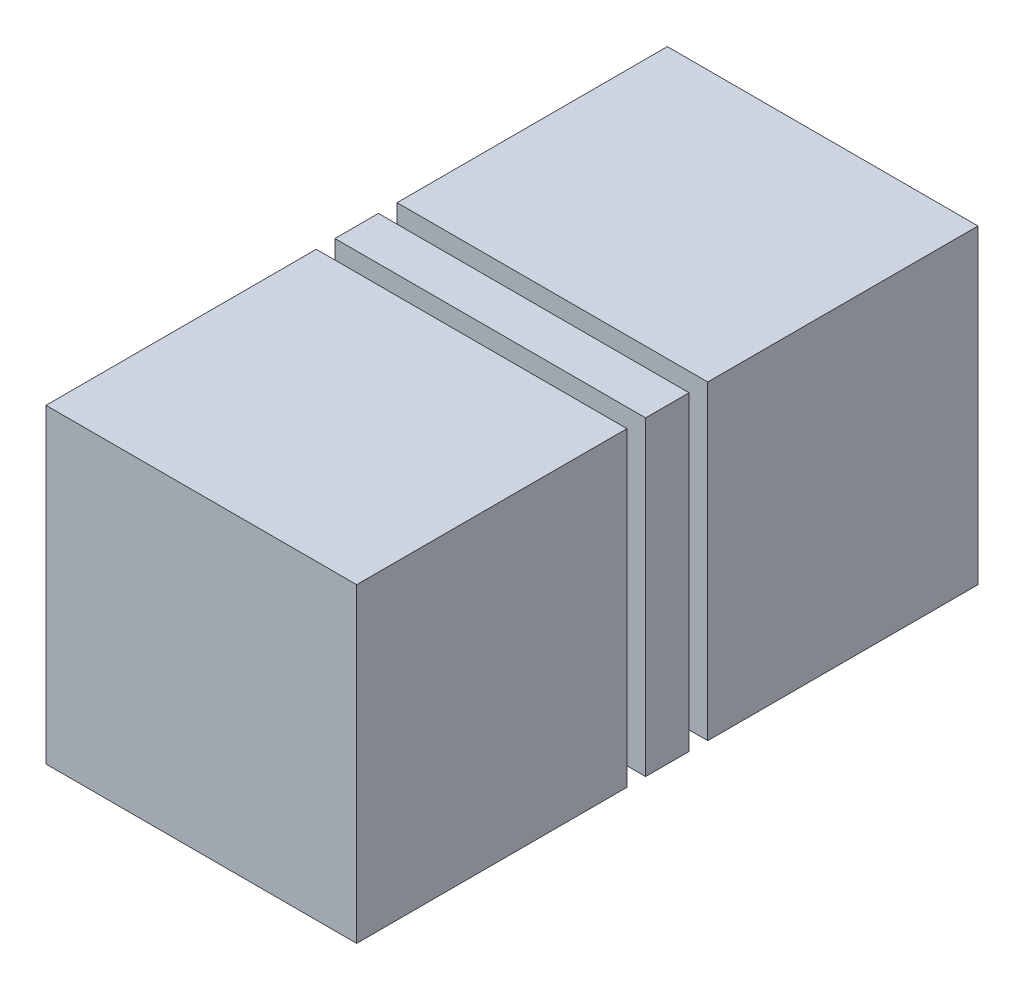
ISO-10303-21;
HEADER;
FILE_DESCRIPTION(('STEP AP214'),'2;1');
FILE_NAME('part.step','',(''),(''),'','','');
FILE_SCHEMA(('AUTOMOTIVE_DESIGN { 1 0 10303 214 1 1 1 1 }'));
ENDSEC;
DATA;
#1=APPLICATION_CONTEXT('core data for automotive mechanical design processes');
#2=APPLICATION_PROTOCOL_DEFINITION('international standard','automotive_design',2000,#1);
#3=PRODUCT_CONTEXT('',#1,'mechanical');
#4=PRODUCT('Part','Part','',(#3));
#5=PRODUCT_RELATED_PRODUCT_CATEGORY('part','',(#4));
#6=PRODUCT_DEFINITION_FORMATION('','',#4);
#7=PRODUCT_DEFINITION_CONTEXT('part definition',#1,'design');
#8=PRODUCT_DEFINITION('design','',#6,#7);
#9=PRODUCT_DEFINITION_SHAPE('','',#8);
#10=(LENGTH_UNIT() NAMED_UNIT(*) SI_UNIT(.MILLI.,.METRE.));
#11=(NAMED_UNIT(*) PLANE_ANGLE_UNIT() SI_UNIT($,.RADIAN.));
#12=(NAMED_UNIT(*) SI_UNIT($,.STERADIAN.) SOLID_ANGLE_UNIT());
#13=UNCERTAINTY_MEASURE_WITH_UNIT(LENGTH_MEASURE(1.E-05),#10,'distance_accuracy_value','');
#14=(GEOMETRIC_REPRESENTATION_CONTEXT(3) GLOBAL_UNCERTAINTY_ASSIGNED_CONTEXT((#13)) GLOBAL_UNIT_ASSIGNED_CONTEXT((#10,
#11,#12)) REPRESENTATION_CONTEXT('',''));
#15=CARTESIAN_POINT('',(0.,0.,0.));
#16=DIRECTION('',(0.,0.,1.));
#17=DIRECTION('',(1.,0.,0.));
#18=AXIS2_PLACEMENT_3D('',#15,#16,#17);
#19=CARTESIAN_POINT('',(25.,-25.,-50.));
#20=DIRECTION('',(0.,1.,0.));
#21=DIRECTION('',(0.,0.,1.));
#22=AXIS2_PLACEMENT_3D('',#19,#20,#21);
#23=PLANE('',#22);
#24=DIRECTION('',(0.,0.,-1.));
#25=VECTOR('',#24,1.);
#26=CARTESIAN_POINT('',(-25.,-25.,-50.));
#27=LINE('',#26,#25);
#28=CARTESIAN_POINT('',(-25.,-25.,3.5));
#29=VERTEX_POINT('',#28);
#30=CARTESIAN_POINT('',(-25.,-25.,-3.5));
#31=VERTEX_POINT('',#30);
#32=EDGE_CURVE('E306',#29,#31,#27,.T.);
#33=ORIENTED_EDGE('',*,*,#32,.T.);
#34=DIRECTION('',(1.,0.,0.));
#35=VECTOR('',#34,1.);
#36=CARTESIAN_POINT('',(25.,-25.,-3.5));
#37=LINE('',#36,#35);
#38=CARTESIAN_POINT('',(25.,-25.,-3.5));
#39=VERTEX_POINT('',#38);
#40=EDGE_CURVE('E55',#31,#39,#37,.T.);
#41=ORIENTED_EDGE('',*,*,#40,.T.);
#42=DIRECTION('',(0.,0.,-1.));
#43=VECTOR('',#42,1.);
#44=CARTESIAN_POINT('',(25.,-25.,-50.));
#45=LINE('',#44,#43);
#46=CARTESIAN_POINT('',(25.,-25.,3.5));
#47=VERTEX_POINT('',#46);
#48=EDGE_CURVE('E291',#47,#39,#45,.T.);
#49=ORIENTED_EDGE('',*,*,#48,.F.);
#50=DIRECTION('',(1.,0.,0.));
#51=VECTOR('',#50,1.);
#52=CARTESIAN_POINT('',(25.,-25.,3.5));
#53=LINE('',#52,#51);
#54=EDGE_CURVE('E269',#29,#47,#53,.T.);
#55=ORIENTED_EDGE('',*,*,#54,.F.);
#56=EDGE_LOOP('',(#33,#41,#49,#55));
#57=FACE_BOUND('',#56,.T.);
#58=ADVANCED_FACE('F32',(#57),#23,.F.);
#59=CARTESIAN_POINT('',(25.,25.,-50.));
#60=DIRECTION('',(0.,-1.,0.));
#61=DIRECTION('',(0.,0.,-1.));
#62=AXIS2_PLACEMENT_3D('',#59,#60,#61);
#63=PLANE('',#62);
#64=DIRECTION('',(0.,0.,1.));
#65=VECTOR('',#64,1.);
#66=CARTESIAN_POINT('',(25.,25.,-50.));
#67=LINE('',#66,#65);
#68=CARTESIAN_POINT('',(25.,25.,-3.5));
#69=VERTEX_POINT('',#68);
#70=CARTESIAN_POINT('',(25.,25.,3.5));
#71=VERTEX_POINT('',#70);
#72=EDGE_CURVE('E298',#69,#71,#67,.T.);
#73=ORIENTED_EDGE('',*,*,#72,.F.);
#74=DIRECTION('',(-1.,0.,0.));
#75=VECTOR('',#74,1.);
#76=CARTESIAN_POINT('',(25.,25.,-3.5));
#77=LINE('',#76,#75);
#78=CARTESIAN_POINT('',(-25.,25.,-3.5));
#79=VERTEX_POINT('',#78);
#80=EDGE_CURVE('E218',#69,#79,#77,.T.);
#81=ORIENTED_EDGE('',*,*,#80,.T.);
#82=DIRECTION('',(0.,0.,1.));
#83=VECTOR('',#82,1.);
#84=CARTESIAN_POINT('',(-25.,25.,-50.));
#85=LINE('',#84,#83);
#86=CARTESIAN_POINT('',(-25.,25.,3.5));
#87=VERTEX_POINT('',#86);
#88=EDGE_CURVE('E311',#79,#87,#85,.T.);
#89=ORIENTED_EDGE('',*,*,#88,.T.);
#90=DIRECTION('',(-1.,0.,0.));
#91=VECTOR('',#90,1.);
#92=CARTESIAN_POINT('',(25.,25.,3.5));
#93=LINE('',#92,#91);
#94=EDGE_CURVE('E263',#71,#87,#93,.T.);
#95=ORIENTED_EDGE('',*,*,#94,.F.);
#96=EDGE_LOOP('',(#73,#81,#89,#95));
#97=FACE_BOUND('',#96,.T.);
#98=ADVANCED_FACE('F368',(#97),#63,.F.);
#99=CARTESIAN_POINT('',(25.,0.,0.));
#100=DIRECTION('',(1.,0.,0.));
#101=DIRECTION('',(0.,0.,-1.));
#102=AXIS2_PLACEMENT_3D('',#99,#100,#101);
#103=PLANE('',#102);
#104=DIRECTION('',(0.,1.,0.));
#105=VECTOR('',#104,1.);
#106=CARTESIAN_POINT('',(25.,25.,-3.5));
#107=LINE('',#106,#105);
#108=EDGE_CURVE('E212',#39,#69,#107,.T.);
#109=ORIENTED_EDGE('',*,*,#108,.T.);
#110=ORIENTED_EDGE('',*,*,#72,.T.);
#111=DIRECTION('',(0.,1.,0.));
#112=VECTOR('',#111,1.);
#113=CARTESIAN_POINT('',(25.,25.,3.5));
#114=LINE('',#113,#112);
#115=EDGE_CURVE('E260',#47,#71,#114,.T.);
#116=ORIENTED_EDGE('',*,*,#115,.F.);
#117=ORIENTED_EDGE('',*,*,#48,.T.);
#118=EDGE_LOOP('',(#109,#110,#116,#117));
#119=FACE_BOUND('',#118,.T.);
#120=ADVANCED_FACE('F340',(#119),#103,.T.);
#121=CARTESIAN_POINT('',(-25.,0.,0.));
#122=DIRECTION('',(1.,0.,0.));
#123=DIRECTION('',(0.,0.,-1.));
#124=AXIS2_PLACEMENT_3D('',#121,#122,#123);
#125=PLANE('',#124);
#126=ORIENTED_EDGE('',*,*,#88,.F.);
#127=DIRECTION('',(0.,-1.,0.));
#128=VECTOR('',#127,1.);
#129=CARTESIAN_POINT('',(-25.,25.,-3.5));
#130=LINE('',#129,#128);
#131=EDGE_CURVE('E216',#79,#31,#130,.T.);
#132=ORIENTED_EDGE('',*,*,#131,.T.);
#133=ORIENTED_EDGE('',*,*,#32,.F.);
#134=DIRECTION('',(0.,-1.,0.));
#135=VECTOR('',#134,1.);
#136=CARTESIAN_POINT('',(-25.,25.,3.5));
#137=LINE('',#136,#135);
#138=EDGE_CURVE('E267',#87,#29,#137,.T.);
#139=ORIENTED_EDGE('',*,*,#138,.F.);
#140=EDGE_LOOP('',(#126,#132,#133,#139));
#141=FACE_BOUND('',#140,.T.);
#142=ADVANCED_FACE('F403',(#141),#125,.F.);
#143=CARTESIAN_POINT('',(0.,0.,3.5));
#144=DIRECTION('',(0.,0.,-1.));
#145=DIRECTION('',(-1.,0.,0.));
#146=AXIS2_PLACEMENT_3D('',#143,#144,#145);
#147=PLANE('',#146);
#148=DIRECTION('',(-1.,0.,0.));
#149=VECTOR('',#148,1.);
#150=CARTESIAN_POINT('',(22.,22.,3.5));
#151=LINE('',#150,#149);
#152=CARTESIAN_POINT('',(22.,22.,3.5));
#153=VERTEX_POINT('',#152);
#154=CARTESIAN_POINT('',(-22.,22.,3.5));
#155=VERTEX_POINT('',#154);
#156=EDGE_CURVE('E228',#153,#155,#151,.T.);
#157=ORIENTED_EDGE('',*,*,#156,.F.);
#158=DIRECTION('',(0.,1.,0.));
#159=VECTOR('',#158,1.);
#160=CARTESIAN_POINT('',(22.,-22.,3.5));
#161=LINE('',#160,#159);
#162=CARTESIAN_POINT('',(22.,-22.,3.5));
#163=VERTEX_POINT('',#162);
#164=EDGE_CURVE('E238',#163,#153,#161,.T.);
#165=ORIENTED_EDGE('',*,*,#164,.F.);
#166=DIRECTION('',(1.,0.,0.));
#167=VECTOR('',#166,1.);
#168=CARTESIAN_POINT('',(-22.,-22.,3.5));
#169=LINE('',#168,#167);
#170=CARTESIAN_POINT('',(-22.,-22.,3.5));
#171=VERTEX_POINT('',#170);
#172=EDGE_CURVE('E235',#171,#163,#169,.T.);
#173=ORIENTED_EDGE('',*,*,#172,.F.);
#174=DIRECTION('',(0.,-1.,0.));
#175=VECTOR('',#174,1.);
#176=CARTESIAN_POINT('',(-22.,22.,3.5));
#177=LINE('',#176,#175);
#178=EDGE_CURVE('E231',#155,#171,#177,.T.);
#179=ORIENTED_EDGE('',*,*,#178,.F.);
#180=EDGE_LOOP('',(#157,#165,#173,#179));
#181=FACE_BOUND('',#180,.T.);
#182=ORIENTED_EDGE('',*,*,#115,.T.);
#183=ORIENTED_EDGE('',*,*,#94,.T.);
#184=ORIENTED_EDGE('',*,*,#138,.T.);
#185=ORIENTED_EDGE('',*,*,#54,.T.);
#186=EDGE_LOOP('',(#182,#183,#184,#185));
#187=FACE_BOUND('',#186,.T.);
#188=ADVANCED_FACE('F401',(#181,#187),#147,.F.);
#189=CARTESIAN_POINT('',(0.,0.,6.5));
#190=DIRECTION('',(0.,0.,-1.));
#191=DIRECTION('',(-1.,0.,0.));
#192=AXIS2_PLACEMENT_3D('',#189,#190,#191);
#193=PLANE('',#192);
#194=DIRECTION('',(0.,-1.,0.));
#195=VECTOR('',#194,1.);
#196=CARTESIAN_POINT('',(-22.,22.,6.5));
#197=LINE('',#196,#195);
#198=CARTESIAN_POINT('',(-22.,22.,6.5));
#199=VERTEX_POINT('',#198);
#200=CARTESIAN_POINT('',(-22.,-22.,6.5));
#201=VERTEX_POINT('',#200);
#202=EDGE_CURVE('E243',#199,#201,#197,.T.);
#203=ORIENTED_EDGE('',*,*,#202,.T.);
#204=DIRECTION('',(1.,0.,0.));
#205=VECTOR('',#204,1.);
#206=CARTESIAN_POINT('',(-22.,-22.,6.5));
#207=LINE('',#206,#205);
#208=CARTESIAN_POINT('',(22.,-22.,6.5));
#209=VERTEX_POINT('',#208);
#210=EDGE_CURVE('E246',#201,#209,#207,.T.);
#211=ORIENTED_EDGE('',*,*,#210,.T.);
#212=DIRECTION('',(0.,1.,0.));
#213=VECTOR('',#212,1.);
#214=CARTESIAN_POINT('',(22.,-22.,6.5));
#215=LINE('',#214,#213);
#216=CARTESIAN_POINT('',(22.,22.,6.5));
#217=VERTEX_POINT('',#216);
#218=EDGE_CURVE('E232',#209,#217,#215,.T.);
#219=ORIENTED_EDGE('',*,*,#218,.T.);
#220=DIRECTION('',(-1.,0.,0.));
#221=VECTOR('',#220,1.);
#222=CARTESIAN_POINT('',(22.,22.,6.5));
#223=LINE('',#222,#221);
#224=EDGE_CURVE('E221',#217,#199,#223,.T.);
#225=ORIENTED_EDGE('',*,*,#224,.T.);
#226=EDGE_LOOP('',(#203,#211,#219,#225));
#227=FACE_BOUND('',#226,.T.);
#228=DIRECTION('',(0.,1.,0.));
#229=VECTOR('',#228,1.);
#230=CARTESIAN_POINT('',(25.,25.,6.5));
#231=LINE('',#230,#229);
#232=CARTESIAN_POINT('',(25.,-25.,6.5));
#233=VERTEX_POINT('',#232);
#234=CARTESIAN_POINT('',(25.,25.,6.5));
#235=VERTEX_POINT('',#234);
#236=EDGE_CURVE('E253',#233,#235,#231,.T.);
#237=ORIENTED_EDGE('',*,*,#236,.F.);
#238=DIRECTION('',(1.,0.,0.));
#239=VECTOR('',#238,1.);
#240=CARTESIAN_POINT('',(25.,-25.,6.5));
#241=LINE('',#240,#239);
#242=CARTESIAN_POINT('',(-25.,-25.,6.5));
#243=VERTEX_POINT('',#242);
#244=EDGE_CURVE('E264',#243,#233,#241,.T.);
#245=ORIENTED_EDGE('',*,*,#244,.F.);
#246=DIRECTION('',(0.,-1.,0.));
#247=VECTOR('',#246,1.);
#248=CARTESIAN_POINT('',(-25.,25.,6.5));
#249=LINE('',#248,#247);
#250=CARTESIAN_POINT('',(-25.,25.,6.5));
#251=VERTEX_POINT('',#250);
#252=EDGE_CURVE('E277',#251,#243,#249,.T.);
#253=ORIENTED_EDGE('',*,*,#252,.F.);
#254=DIRECTION('',(-1.,0.,0.));
#255=VECTOR('',#254,1.);
#256=CARTESIAN_POINT('',(25.,25.,6.5));
#257=LINE('',#256,#255);
#258=EDGE_CURVE('E274',#235,#251,#257,.T.);
#259=ORIENTED_EDGE('',*,*,#258,.F.);
#260=EDGE_LOOP('',(#237,#245,#253,#259));
#261=FACE_BOUND('',#260,.T.);
#262=ADVANCED_FACE('F398',(#227,#261),#193,.T.);
#263=CARTESIAN_POINT('',(22.,22.,3.5));
#264=DIRECTION('',(0.,1.,0.));
#265=DIRECTION('',(0.,0.,1.));
#266=AXIS2_PLACEMENT_3D('',#263,#264,#265);
#267=PLANE('',#266);
#268=ORIENTED_EDGE('',*,*,#224,.F.);
#269=DIRECTION('',(0.,0.,1.));
#270=VECTOR('',#269,1.);
#271=CARTESIAN_POINT('',(22.,22.,3.5));
#272=LINE('',#271,#270);
#273=EDGE_CURVE('E251',#153,#217,#272,.T.);
#274=ORIENTED_EDGE('',*,*,#273,.F.);
#275=ORIENTED_EDGE('',*,*,#156,.T.);
#276=DIRECTION('',(0.,0.,1.));
#277=VECTOR('',#276,1.);
#278=CARTESIAN_POINT('',(-22.,22.,3.5));
#279=LINE('',#278,#277);
#280=EDGE_CURVE('E241',#155,#199,#279,.T.);
#281=ORIENTED_EDGE('',*,*,#280,.T.);
#282=EDGE_LOOP('',(#268,#274,#275,#281));
#283=FACE_BOUND('',#282,.T.);
#284=ADVANCED_FACE('F498',(#283),#267,.T.);
#285=CARTESIAN_POINT('',(22.,-22.,3.5));
#286=DIRECTION('',(1.,0.,0.));
#287=DIRECTION('',(0.,0.,-1.));
#288=AXIS2_PLACEMENT_3D('',#285,#286,#287);
#289=PLANE('',#288);
#290=ORIENTED_EDGE('',*,*,#218,.F.);
#291=DIRECTION('',(0.,0.,1.));
#292=VECTOR('',#291,1.);
#293=CARTESIAN_POINT('',(22.,-22.,3.5));
#294=LINE('',#293,#292);
#295=EDGE_CURVE('E254',#163,#209,#294,.T.);
#296=ORIENTED_EDGE('',*,*,#295,.F.);
#297=ORIENTED_EDGE('',*,*,#164,.T.);
#298=ORIENTED_EDGE('',*,*,#273,.T.);
#299=EDGE_LOOP('',(#290,#296,#297,#298));
#300=FACE_BOUND('',#299,.T.);
#301=ADVANCED_FACE('F494',(#300),#289,.T.);
#302=CARTESIAN_POINT('',(-22.,-22.,3.5));
#303=DIRECTION('',(0.,-1.,0.));
#304=DIRECTION('',(0.,0.,-1.));
#305=AXIS2_PLACEMENT_3D('',#302,#303,#304);
#306=PLANE('',#305);
#307=ORIENTED_EDGE('',*,*,#210,.F.);
#308=DIRECTION('',(0.,0.,1.));
#309=VECTOR('',#308,1.);
#310=CARTESIAN_POINT('',(-22.,-22.,3.5));
#311=LINE('',#310,#309);
#312=EDGE_CURVE('E256',#171,#201,#311,.T.);
#313=ORIENTED_EDGE('',*,*,#312,.F.);
#314=ORIENTED_EDGE('',*,*,#172,.T.);
#315=ORIENTED_EDGE('',*,*,#295,.T.);
#316=EDGE_LOOP('',(#307,#313,#314,#315));
#317=FACE_BOUND('',#316,.T.);
#318=ADVANCED_FACE('F497',(#317),#306,.T.);
#319=CARTESIAN_POINT('',(-22.,22.,3.5));
#320=DIRECTION('',(-1.,0.,0.));
#321=DIRECTION('',(0.,0.,1.));
#322=AXIS2_PLACEMENT_3D('',#319,#320,#321);
#323=PLANE('',#322);
#324=ORIENTED_EDGE('',*,*,#202,.F.);
#325=ORIENTED_EDGE('',*,*,#280,.F.);
#326=ORIENTED_EDGE('',*,*,#178,.T.);
#327=ORIENTED_EDGE('',*,*,#312,.T.);
#328=EDGE_LOOP('',(#324,#325,#326,#327));
#329=FACE_BOUND('',#328,.T.);
#330=ADVANCED_FACE('F421',(#329),#323,.T.);
#331=CARTESIAN_POINT('',(25.,-25.,50.));
#332=DIRECTION('',(0.,0.,-1.));
#333=DIRECTION('',(-1.,0.,0.));
#334=AXIS2_PLACEMENT_3D('',#331,#332,#333);
#335=PLANE('',#334);
#336=DIRECTION('',(0.,-1.,0.));
#337=VECTOR('',#336,1.);
#338=CARTESIAN_POINT('',(-25.,-25.,50.));
#339=LINE('',#338,#337);
#340=CARTESIAN_POINT('',(-25.,25.,50.));
#341=VERTEX_POINT('',#340);
#342=CARTESIAN_POINT('',(-25.,-25.,50.));
#343=VERTEX_POINT('',#342);
#344=EDGE_CURVE('E271',#341,#343,#339,.T.);
#345=ORIENTED_EDGE('',*,*,#344,.T.);
#346=DIRECTION('',(-1.,0.,0.));
#347=VECTOR('',#346,1.);
#348=CARTESIAN_POINT('',(25.,-25.,50.));
#349=LINE('',#348,#347);
#350=CARTESIAN_POINT('',(25.,-25.,50.));
#351=VERTEX_POINT('',#350);
#352=EDGE_CURVE('E11',#351,#343,#349,.T.);
#353=ORIENTED_EDGE('',*,*,#352,.F.);
#354=DIRECTION('',(0.,-1.,0.));
#355=VECTOR('',#354,1.);
#356=CARTESIAN_POINT('',(25.,-25.,50.));
#357=LINE('',#356,#355);
#358=CARTESIAN_POINT('',(25.,25.,50.));
#359=VERTEX_POINT('',#358);
#360=EDGE_CURVE('E282',#359,#351,#357,.T.);
#361=ORIENTED_EDGE('',*,*,#360,.F.);
#362=DIRECTION('',(-1.,0.,0.));
#363=VECTOR('',#362,1.);
#364=CARTESIAN_POINT('',(25.,25.,50.));
#365=LINE('',#364,#363);
#366=EDGE_CURVE('E297',#359,#341,#365,.T.);
#367=ORIENTED_EDGE('',*,*,#366,.T.);
#368=EDGE_LOOP('',(#345,#353,#361,#367));
#369=FACE_BOUND('',#368,.T.);
#370=ADVANCED_FACE('F34',(#369),#335,.F.);
#371=EDGE_CURVE('E287',#351,#233,#45,.T.);
#372=ORIENTED_EDGE('',*,*,#371,.T.);
#373=ORIENTED_EDGE('',*,*,#236,.T.);
#374=EDGE_CURVE('E293',#235,#359,#67,.T.);
#375=ORIENTED_EDGE('',*,*,#374,.T.);
#376=ORIENTED_EDGE('',*,*,#360,.T.);
#377=EDGE_LOOP('',(#372,#373,#375,#376));
#378=FACE_BOUND('',#377,.T.);
#379=ADVANCED_FACE('F389',(#378),#103,.T.);
#380=ORIENTED_EDGE('',*,*,#252,.T.);
#381=EDGE_CURVE('E302',#343,#243,#27,.T.);
#382=ORIENTED_EDGE('',*,*,#381,.F.);
#383=ORIENTED_EDGE('',*,*,#344,.F.);
#384=EDGE_CURVE('E308',#251,#341,#85,.T.);
#385=ORIENTED_EDGE('',*,*,#384,.F.);
#386=EDGE_LOOP('',(#380,#382,#383,#385));
#387=FACE_BOUND('',#386,.T.);
#388=ADVANCED_FACE('F385',(#387),#125,.F.);
#389=ORIENTED_EDGE('',*,*,#258,.T.);
#390=ORIENTED_EDGE('',*,*,#384,.T.);
#391=ORIENTED_EDGE('',*,*,#366,.F.);
#392=ORIENTED_EDGE('',*,*,#374,.F.);
#393=EDGE_LOOP('',(#389,#390,#391,#392));
#394=FACE_BOUND('',#393,.T.);
#395=ADVANCED_FACE('F375',(#394),#63,.F.);
#396=ORIENTED_EDGE('',*,*,#244,.T.);
#397=ORIENTED_EDGE('',*,*,#371,.F.);
#398=ORIENTED_EDGE('',*,*,#352,.T.);
#399=ORIENTED_EDGE('',*,*,#381,.T.);
#400=EDGE_LOOP('',(#396,#397,#398,#399));
#401=FACE_BOUND('',#400,.T.);
#402=ADVANCED_FACE('F369',(#401),#23,.F.);
#403=CARTESIAN_POINT('',(0.,0.,-3.5));
#404=DIRECTION('',(0.,0.,1.));
#405=DIRECTION('',(-1.,0.,0.));
#406=AXIS2_PLACEMENT_3D('',#403,#404,#405);
#407=PLANE('',#406);
#408=ORIENTED_EDGE('',*,*,#108,.F.);
#409=ORIENTED_EDGE('',*,*,#40,.F.);
#410=ORIENTED_EDGE('',*,*,#131,.F.);
#411=ORIENTED_EDGE('',*,*,#80,.F.);
#412=EDGE_LOOP('',(#408,#409,#410,#411));
#413=FACE_BOUND('',#412,.T.);
#414=DIRECTION('',(0.,-1.,0.));
#415=VECTOR('',#414,1.);
#416=CARTESIAN_POINT('',(-22.,22.,-3.5));
#417=LINE('',#416,#415);
#418=CARTESIAN_POINT('',(-22.,22.,-3.5));
#419=VERTEX_POINT('',#418);
#420=CARTESIAN_POINT('',(-22.,-22.,-3.5));
#421=VERTEX_POINT('',#420);
#422=EDGE_CURVE('E188',#419,#421,#417,.T.);
#423=ORIENTED_EDGE('',*,*,#422,.T.);
#424=DIRECTION('',(1.,0.,0.));
#425=VECTOR('',#424,1.);
#426=CARTESIAN_POINT('',(-22.,-22.,-3.5));
#427=LINE('',#426,#425);
#428=CARTESIAN_POINT('',(22.,-22.,-3.5));
#429=VERTEX_POINT('',#428);
#430=EDGE_CURVE('E176',#421,#429,#427,.T.);
#431=ORIENTED_EDGE('',*,*,#430,.T.);
#432=DIRECTION('',(0.,1.,0.));
#433=VECTOR('',#432,1.);
#434=CARTESIAN_POINT('',(22.,-22.,-3.5));
#435=LINE('',#434,#433);
#436=CARTESIAN_POINT('',(22.,22.,-3.5));
#437=VERTEX_POINT('',#436);
#438=EDGE_CURVE('E169',#429,#437,#435,.T.);
#439=ORIENTED_EDGE('',*,*,#438,.T.);
#440=DIRECTION('',(-1.,0.,0.));
#441=VECTOR('',#440,1.);
#442=CARTESIAN_POINT('',(22.,22.,-3.5));
#443=LINE('',#442,#441);
#444=EDGE_CURVE('E173',#437,#419,#443,.T.);
#445=ORIENTED_EDGE('',*,*,#444,.T.);
#446=EDGE_LOOP('',(#423,#431,#439,#445));
#447=FACE_BOUND('',#446,.T.);
#448=ADVANCED_FACE('F171',(#413,#447),#407,.F.);
#449=CARTESIAN_POINT('',(0.,0.,-6.5));
#450=DIRECTION('',(0.,0.,1.));
#451=DIRECTION('',(-1.,0.,0.));
#452=AXIS2_PLACEMENT_3D('',#449,#450,#451);
#453=PLANE('',#452);
#454=DIRECTION('',(0.,1.,0.));
#455=VECTOR('',#454,1.);
#456=CARTESIAN_POINT('',(25.,25.,-6.5));
#457=LINE('',#456,#455);
#458=CARTESIAN_POINT('',(25.,-25.,-6.5));
#459=VERTEX_POINT('',#458);
#460=CARTESIAN_POINT('',(25.,25.,-6.5));
#461=VERTEX_POINT('',#460);
#462=EDGE_CURVE('E208',#459,#461,#457,.T.);
#463=ORIENTED_EDGE('',*,*,#462,.T.);
#464=DIRECTION('',(-1.,0.,0.));
#465=VECTOR('',#464,1.);
#466=CARTESIAN_POINT('',(25.,25.,-6.5));
#467=LINE('',#466,#465);
#468=CARTESIAN_POINT('',(-25.,25.,-6.5));
#469=VERTEX_POINT('',#468);
#470=EDGE_CURVE('E47',#461,#469,#467,.T.);
#471=ORIENTED_EDGE('',*,*,#470,.T.);
#472=DIRECTION('',(0.,-1.,0.));
#473=VECTOR('',#472,1.);
#474=CARTESIAN_POINT('',(-25.,25.,-6.5));
#475=LINE('',#474,#473);
#476=CARTESIAN_POINT('',(-25.,-25.,-6.5));
#477=VERTEX_POINT('',#476);
#478=EDGE_CURVE('E225',#469,#477,#475,.T.);
#479=ORIENTED_EDGE('',*,*,#478,.T.);
#480=DIRECTION('',(1.,0.,0.));
#481=VECTOR('',#480,1.);
#482=CARTESIAN_POINT('',(25.,-25.,-6.5));
#483=LINE('',#482,#481);
#484=EDGE_CURVE('E223',#477,#459,#483,.T.);
#485=ORIENTED_EDGE('',*,*,#484,.T.);
#486=EDGE_LOOP('',(#463,#471,#479,#485));
#487=FACE_BOUND('',#486,.T.);
#488=DIRECTION('',(-1.,0.,0.));
#489=VECTOR('',#488,1.);
#490=CARTESIAN_POINT('',(22.,22.,-6.5));
#491=LINE('',#490,#489);
#492=CARTESIAN_POINT('',(22.,22.,-6.5));
#493=VERTEX_POINT('',#492);
#494=CARTESIAN_POINT('',(-22.,22.,-6.5));
#495=VERTEX_POINT('',#494);
#496=EDGE_CURVE('E202',#493,#495,#491,.T.);
#497=ORIENTED_EDGE('',*,*,#496,.F.);
#498=DIRECTION('',(0.,1.,0.));
#499=VECTOR('',#498,1.);
#500=CARTESIAN_POINT('',(22.,-22.,-6.5));
#501=LINE('',#500,#499);
#502=CARTESIAN_POINT('',(22.,-22.,-6.5));
#503=VERTEX_POINT('',#502);
#504=EDGE_CURVE('E184',#503,#493,#501,.T.);
#505=ORIENTED_EDGE('',*,*,#504,.F.);
#506=DIRECTION('',(1.,0.,0.));
#507=VECTOR('',#506,1.);
#508=CARTESIAN_POINT('',(-22.,-22.,-6.5));
#509=LINE('',#508,#507);
#510=CARTESIAN_POINT('',(-22.,-22.,-6.5));
#511=VERTEX_POINT('',#510);
#512=EDGE_CURVE('E197',#511,#503,#509,.T.);
#513=ORIENTED_EDGE('',*,*,#512,.F.);
#514=DIRECTION('',(0.,-1.,0.));
#515=VECTOR('',#514,1.);
#516=CARTESIAN_POINT('',(-22.,22.,-6.5));
#517=LINE('',#516,#515);
#518=EDGE_CURVE('E194',#495,#511,#517,.T.);
#519=ORIENTED_EDGE('',*,*,#518,.F.);
#520=EDGE_LOOP('',(#497,#505,#513,#519));
#521=FACE_BOUND('',#520,.T.);
#522=ADVANCED_FACE('F349',(#487,#521),#453,.T.);
#523=CARTESIAN_POINT('',(22.,22.,-3.5));
#524=DIRECTION('',(0.,-1.,0.));
#525=DIRECTION('',(0.,0.,-1.));
#526=AXIS2_PLACEMENT_3D('',#523,#524,#525);
#527=PLANE('',#526);
#528=ORIENTED_EDGE('',*,*,#496,.T.);
#529=DIRECTION('',(0.,0.,-1.));
#530=VECTOR('',#529,1.);
#531=CARTESIAN_POINT('',(-22.,22.,-3.5));
#532=LINE('',#531,#530);
#533=EDGE_CURVE('E192',#419,#495,#532,.T.);
#534=ORIENTED_EDGE('',*,*,#533,.F.);
#535=ORIENTED_EDGE('',*,*,#444,.F.);
#536=DIRECTION('',(0.,0.,-1.));
#537=VECTOR('',#536,1.);
#538=CARTESIAN_POINT('',(22.,22.,-3.5));
#539=LINE('',#538,#537);
#540=EDGE_CURVE('E181',#437,#493,#539,.T.);
#541=ORIENTED_EDGE('',*,*,#540,.T.);
#542=EDGE_LOOP('',(#528,#534,#535,#541));
#543=FACE_BOUND('',#542,.T.);
#544=ADVANCED_FACE('F190',(#543),#527,.F.);
#545=CARTESIAN_POINT('',(-22.,22.,-3.5));
#546=DIRECTION('',(1.,0.,0.));
#547=DIRECTION('',(0.,0.,-1.));
#548=AXIS2_PLACEMENT_3D('',#545,#546,#547);
#549=PLANE('',#548);
#550=ORIENTED_EDGE('',*,*,#518,.T.);
#551=DIRECTION('',(0.,0.,-1.));
#552=VECTOR('',#551,1.);
#553=CARTESIAN_POINT('',(-22.,-22.,-3.5));
#554=LINE('',#553,#552);
#555=EDGE_CURVE('E209',#421,#511,#554,.T.);
#556=ORIENTED_EDGE('',*,*,#555,.F.);
#557=ORIENTED_EDGE('',*,*,#422,.F.);
#558=ORIENTED_EDGE('',*,*,#533,.T.);
#559=EDGE_LOOP('',(#550,#556,#557,#558));
#560=FACE_BOUND('',#559,.T.);
#561=ADVANCED_FACE('F356',(#560),#549,.F.);
#562=CARTESIAN_POINT('',(-22.,-22.,-3.5));
#563=DIRECTION('',(0.,1.,0.));
#564=DIRECTION('',(0.,0.,1.));
#565=AXIS2_PLACEMENT_3D('',#562,#563,#564);
#566=PLANE('',#565);
#567=ORIENTED_EDGE('',*,*,#512,.T.);
#568=DIRECTION('',(0.,0.,-1.));
#569=VECTOR('',#568,1.);
#570=CARTESIAN_POINT('',(22.,-22.,-3.5));
#571=LINE('',#570,#569);
#572=EDGE_CURVE('E187',#429,#503,#571,.T.);
#573=ORIENTED_EDGE('',*,*,#572,.F.);
#574=ORIENTED_EDGE('',*,*,#430,.F.);
#575=ORIENTED_EDGE('',*,*,#555,.T.);
#576=EDGE_LOOP('',(#567,#573,#574,#575));
#577=FACE_BOUND('',#576,.T.);
#578=ADVANCED_FACE('F358',(#577),#566,.F.);
#579=CARTESIAN_POINT('',(22.,-22.,-3.5));
#580=DIRECTION('',(-1.,0.,0.));
#581=DIRECTION('',(0.,0.,1.));
#582=AXIS2_PLACEMENT_3D('',#579,#580,#581);
#583=PLANE('',#582);
#584=ORIENTED_EDGE('',*,*,#504,.T.);
#585=ORIENTED_EDGE('',*,*,#540,.F.);
#586=ORIENTED_EDGE('',*,*,#438,.F.);
#587=ORIENTED_EDGE('',*,*,#572,.T.);
#588=EDGE_LOOP('',(#584,#585,#586,#587));
#589=FACE_BOUND('',#588,.T.);
#590=ADVANCED_FACE('F182',(#589),#583,.F.);
#591=CARTESIAN_POINT('',(25.,-25.,-50.));
#592=DIRECTION('',(0.,0.,1.));
#593=DIRECTION('',(1.,0.,0.));
#594=AXIS2_PLACEMENT_3D('',#591,#592,#593);
#595=PLANE('',#594);
#596=DIRECTION('',(0.,1.,0.));
#597=VECTOR('',#596,1.);
#598=CARTESIAN_POINT('',(-25.,-25.,-50.));
#599=LINE('',#598,#597);
#600=CARTESIAN_POINT('',(-25.,-25.,-50.));
#601=VERTEX_POINT('',#600);
#602=CARTESIAN_POINT('',(-25.,25.,-50.));
#603=VERTEX_POINT('',#602);
#604=EDGE_CURVE('E305',#601,#603,#599,.T.);
#605=ORIENTED_EDGE('',*,*,#604,.T.);
#606=DIRECTION('',(-1.,0.,0.));
#607=VECTOR('',#606,1.);
#608=CARTESIAN_POINT('',(25.,25.,-50.));
#609=LINE('',#608,#607);
#610=CARTESIAN_POINT('',(25.,25.,-50.));
#611=VERTEX_POINT('',#610);
#612=EDGE_CURVE('E314',#611,#603,#609,.T.);
#613=ORIENTED_EDGE('',*,*,#612,.F.);
#614=DIRECTION('',(0.,1.,0.));
#615=VECTOR('',#614,1.);
#616=CARTESIAN_POINT('',(25.,-25.,-50.));
#617=LINE('',#616,#615);
#618=CARTESIAN_POINT('',(25.,-25.,-50.));
#619=VERTEX_POINT('',#618);
#620=EDGE_CURVE('E290',#619,#611,#617,.T.);
#621=ORIENTED_EDGE('',*,*,#620,.F.);
#622=DIRECTION('',(-1.,0.,0.));
#623=VECTOR('',#622,1.);
#624=CARTESIAN_POINT('',(25.,-25.,-50.));
#625=LINE('',#624,#623);
#626=EDGE_CURVE('E40',#619,#601,#625,.T.);
#627=ORIENTED_EDGE('',*,*,#626,.T.);
#628=EDGE_LOOP('',(#605,#613,#621,#627));
#629=FACE_BOUND('',#628,.T.);
#630=ADVANCED_FACE('F321',(#629),#595,.F.);
#631=ORIENTED_EDGE('',*,*,#478,.F.);
#632=EDGE_CURVE('E286',#603,#469,#85,.T.);
#633=ORIENTED_EDGE('',*,*,#632,.F.);
#634=ORIENTED_EDGE('',*,*,#604,.F.);
#635=EDGE_CURVE('E301',#477,#601,#27,.T.);
#636=ORIENTED_EDGE('',*,*,#635,.F.);
#637=EDGE_LOOP('',(#631,#633,#634,#636));
#638=FACE_BOUND('',#637,.T.);
#639=ADVANCED_FACE('F328',(#638),#125,.F.);
#640=EDGE_CURVE('E294',#611,#461,#67,.T.);
#641=ORIENTED_EDGE('',*,*,#640,.T.);
#642=ORIENTED_EDGE('',*,*,#462,.F.);
#643=EDGE_CURVE('E285',#459,#619,#45,.T.);
#644=ORIENTED_EDGE('',*,*,#643,.T.);
#645=ORIENTED_EDGE('',*,*,#620,.T.);
#646=EDGE_LOOP('',(#641,#642,#644,#645));
#647=FACE_BOUND('',#646,.T.);
#648=ADVANCED_FACE('F334',(#647),#103,.T.);
#649=ORIENTED_EDGE('',*,*,#470,.F.);
#650=ORIENTED_EDGE('',*,*,#640,.F.);
#651=ORIENTED_EDGE('',*,*,#612,.T.);
#652=ORIENTED_EDGE('',*,*,#632,.T.);
#653=EDGE_LOOP('',(#649,#650,#651,#652));
#654=FACE_BOUND('',#653,.T.);
#655=ADVANCED_FACE('F330',(#654),#63,.F.);
#656=ORIENTED_EDGE('',*,*,#484,.F.);
#657=ORIENTED_EDGE('',*,*,#635,.T.);
#658=ORIENTED_EDGE('',*,*,#626,.F.);
#659=ORIENTED_EDGE('',*,*,#643,.F.);
#660=EDGE_LOOP('',(#656,#657,#658,#659));
#661=FACE_BOUND('',#660,.T.);
#662=ADVANCED_FACE('F348',(#661),#23,.F.);
#663=CLOSED_SHELL('',(#58,#98,#120,#142,#188,#262,#284,#301,#318,#330,#370,#379,#388,#395,#402,
#448,#522,#544,#561,#578,#590,#630,#639,#648,#655,#662));
#664=MANIFOLD_SOLID_BREP('B2',#663);
#665=ADVANCED_BREP_SHAPE_REPRESENTATION('',(#18,#664),#14);
#666=SHAPE_DEFINITION_REPRESENTATION(#9,#665);
ENDSEC;
END-ISO-10303-21;
